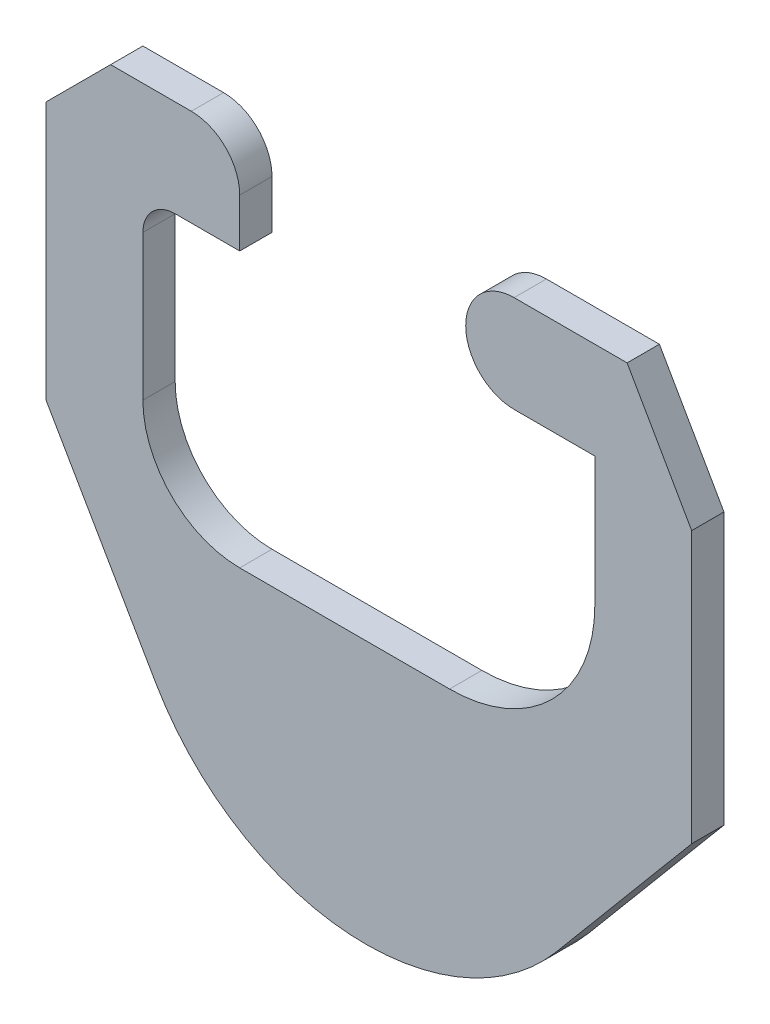
ISO-10303-21;
HEADER;
FILE_DESCRIPTION(('STEP AP214'),'2;1');
FILE_NAME('part.step','',(''),(''),'','','');
FILE_SCHEMA(('AUTOMOTIVE_DESIGN { 1 0 10303 214 1 1 1 1 }'));
ENDSEC;
DATA;
#1=APPLICATION_CONTEXT('core data for automotive mechanical design processes');
#2=APPLICATION_PROTOCOL_DEFINITION('international standard','automotive_design',2000,#1);
#3=PRODUCT_CONTEXT('',#1,'mechanical');
#4=PRODUCT('Part','Part','',(#3));
#5=PRODUCT_RELATED_PRODUCT_CATEGORY('part','',(#4));
#6=PRODUCT_DEFINITION_FORMATION('','',#4);
#7=PRODUCT_DEFINITION_CONTEXT('part definition',#1,'design');
#8=PRODUCT_DEFINITION('design','',#6,#7);
#9=PRODUCT_DEFINITION_SHAPE('','',#8);
#10=(LENGTH_UNIT() NAMED_UNIT(*) SI_UNIT(.MILLI.,.METRE.));
#11=(NAMED_UNIT(*) PLANE_ANGLE_UNIT() SI_UNIT($,.RADIAN.));
#12=(NAMED_UNIT(*) SI_UNIT($,.STERADIAN.) SOLID_ANGLE_UNIT());
#13=UNCERTAINTY_MEASURE_WITH_UNIT(LENGTH_MEASURE(1.E-05),#10,'distance_accuracy_value','');
#14=(GEOMETRIC_REPRESENTATION_CONTEXT(3) GLOBAL_UNCERTAINTY_ASSIGNED_CONTEXT((#13)) GLOBAL_UNIT_ASSIGNED_CONTEXT((#10,
#11,#12)) REPRESENTATION_CONTEXT('',''));
#15=CARTESIAN_POINT('',(0.,0.,0.));
#16=DIRECTION('',(0.,0.,1.));
#17=DIRECTION('',(1.,0.,0.));
#18=AXIS2_PLACEMENT_3D('',#15,#16,#17);
#19=CARTESIAN_POINT('',(0.,-15.,10.));
#20=DIRECTION('',(0.,0.,-1.));
#21=DIRECTION('',(-1.,0.,0.));
#22=AXIS2_PLACEMENT_3D('',#19,#20,#21);
#23=CYLINDRICAL_SURFACE('',#22,15.);
#24=CARTESIAN_POINT('',(0.,-15.,0.));
#25=DIRECTION('',(0.,0.,1.));
#26=DIRECTION('',(-1.,0.,0.));
#27=AXIS2_PLACEMENT_3D('',#24,#25,#26);
#28=CIRCLE('',#27,15.);
#29=CARTESIAN_POINT('',(0.,0.,0.));
#30=VERTEX_POINT('',#29);
#31=CARTESIAN_POINT('',(0.,-30.,0.));
#32=VERTEX_POINT('',#31);
#33=EDGE_CURVE('E218',#30,#32,#28,.T.);
#34=ORIENTED_EDGE('',*,*,#33,.T.);
#35=DIRECTION('',(0.,0.,-1.));
#36=VECTOR('',#35,1.);
#37=CARTESIAN_POINT('',(0.,-30.,10.));
#38=LINE('',#37,#36);
#39=CARTESIAN_POINT('',(0.,-30.,10.));
#40=VERTEX_POINT('',#39);
#41=EDGE_CURVE('E11',#40,#32,#38,.T.);
#42=ORIENTED_EDGE('',*,*,#41,.F.);
#43=CARTESIAN_POINT('',(0.,-15.,10.));
#44=DIRECTION('',(0.,0.,1.));
#45=DIRECTION('',(-1.,0.,0.));
#46=AXIS2_PLACEMENT_3D('',#43,#44,#45);
#47=CIRCLE('',#46,15.);
#48=CARTESIAN_POINT('',(0.,0.,10.));
#49=VERTEX_POINT('',#48);
#50=EDGE_CURVE('E279',#49,#40,#47,.T.);
#51=ORIENTED_EDGE('',*,*,#50,.F.);
#52=DIRECTION('',(0.,0.,-1.));
#53=VECTOR('',#52,1.);
#54=CARTESIAN_POINT('',(0.,0.,10.));
#55=LINE('',#54,#53);
#56=EDGE_CURVE('E214',#49,#30,#55,.T.);
#57=ORIENTED_EDGE('',*,*,#56,.T.);
#58=EDGE_LOOP('',(#34,#42,#51,#57));
#59=FACE_BOUND('',#58,.T.);
#60=ADVANCED_FACE('F39',(#59),#23,.T.);
#61=CARTESIAN_POINT('',(25.,-30.,10.));
#62=DIRECTION('',(0.,1.,0.));
#63=DIRECTION('',(0.,0.,1.));
#64=AXIS2_PLACEMENT_3D('',#61,#62,#63);
#65=PLANE('',#64);
#66=DIRECTION('',(1.,0.,0.));
#67=VECTOR('',#66,1.);
#68=CARTESIAN_POINT('',(25.,-30.,0.));
#69=LINE('',#68,#67);
#70=CARTESIAN_POINT('',(25.,-30.,0.));
#71=VERTEX_POINT('',#70);
#72=EDGE_CURVE('E222',#32,#71,#69,.T.);
#73=ORIENTED_EDGE('',*,*,#72,.T.);
#74=DIRECTION('',(0.,0.,-1.));
#75=VECTOR('',#74,1.);
#76=CARTESIAN_POINT('',(25.,-30.,10.));
#77=LINE('',#76,#75);
#78=CARTESIAN_POINT('',(25.,-30.,10.));
#79=VERTEX_POINT('',#78);
#80=EDGE_CURVE('E48',#79,#71,#77,.T.);
#81=ORIENTED_EDGE('',*,*,#80,.F.);
#82=DIRECTION('',(1.,0.,0.));
#83=VECTOR('',#82,1.);
#84=CARTESIAN_POINT('',(25.,-30.,10.));
#85=LINE('',#84,#83);
#86=EDGE_CURVE('E138',#40,#79,#85,.T.);
#87=ORIENTED_EDGE('',*,*,#86,.F.);
#88=ORIENTED_EDGE('',*,*,#41,.T.);
#89=EDGE_LOOP('',(#73,#81,#87,#88));
#90=FACE_BOUND('',#89,.T.);
#91=ADVANCED_FACE('F436',(#90),#65,.F.);
#92=CARTESIAN_POINT('',(25.,-70.,10.));
#93=DIRECTION('',(1.,0.,0.));
#94=DIRECTION('',(0.,1.,0.));
#95=AXIS2_PLACEMENT_3D('',#92,#93,#94);
#96=PLANE('',#95);
#97=DIRECTION('',(0.,-1.,0.));
#98=VECTOR('',#97,1.);
#99=CARTESIAN_POINT('',(25.,-70.,0.));
#100=LINE('',#99,#98);
#101=CARTESIAN_POINT('',(25.,-70.,0.));
#102=VERTEX_POINT('',#101);
#103=EDGE_CURVE('E225',#71,#102,#100,.T.);
#104=ORIENTED_EDGE('',*,*,#103,.T.);
#105=DIRECTION('',(0.,0.,-1.));
#106=VECTOR('',#105,1.);
#107=CARTESIAN_POINT('',(25.,-70.,10.));
#108=LINE('',#107,#106);
#109=CARTESIAN_POINT('',(25.,-70.,10.));
#110=VERTEX_POINT('',#109);
#111=EDGE_CURVE('E342',#110,#102,#108,.T.);
#112=ORIENTED_EDGE('',*,*,#111,.F.);
#113=DIRECTION('',(0.,-1.,0.));
#114=VECTOR('',#113,1.);
#115=CARTESIAN_POINT('',(25.,-70.,10.));
#116=LINE('',#115,#114);
#117=EDGE_CURVE('E352',#79,#110,#116,.T.);
#118=ORIENTED_EDGE('',*,*,#117,.F.);
#119=ORIENTED_EDGE('',*,*,#80,.T.);
#120=EDGE_LOOP('',(#104,#112,#118,#119));
#121=FACE_BOUND('',#120,.T.);
#122=ADVANCED_FACE('F350',(#121),#96,.F.);
#123=CARTESIAN_POINT('',(-20.,-70.,10.));
#124=DIRECTION('',(0.,0.,-1.));
#125=DIRECTION('',(-1.,0.,0.));
#126=AXIS2_PLACEMENT_3D('',#123,#124,#125);
#127=CYLINDRICAL_SURFACE('',#126,45.);
#128=CARTESIAN_POINT('',(-20.,-70.,0.));
#129=DIRECTION('',(0.,0.,-1.));
#130=DIRECTION('',(1.,0.,0.));
#131=AXIS2_PLACEMENT_3D('',#128,#129,#130);
#132=CIRCLE('',#131,45.);
#133=CARTESIAN_POINT('',(-20.,-115.,0.));
#134=VERTEX_POINT('',#133);
#135=EDGE_CURVE('E228',#102,#134,#132,.T.);
#136=ORIENTED_EDGE('',*,*,#135,.T.);
#137=DIRECTION('',(0.,0.,-1.));
#138=VECTOR('',#137,1.);
#139=CARTESIAN_POINT('',(-20.,-115.,10.));
#140=LINE('',#139,#138);
#141=CARTESIAN_POINT('',(-20.,-115.,10.));
#142=VERTEX_POINT('',#141);
#143=EDGE_CURVE('E338',#142,#134,#140,.T.);
#144=ORIENTED_EDGE('',*,*,#143,.F.);
#145=CARTESIAN_POINT('',(-20.,-70.,10.));
#146=DIRECTION('',(0.,0.,-1.));
#147=DIRECTION('',(1.,0.,0.));
#148=AXIS2_PLACEMENT_3D('',#145,#146,#147);
#149=CIRCLE('',#148,45.);
#150=EDGE_CURVE('E371',#110,#142,#149,.T.);
#151=ORIENTED_EDGE('',*,*,#150,.F.);
#152=ORIENTED_EDGE('',*,*,#111,.T.);
#153=EDGE_LOOP('',(#136,#144,#151,#152));
#154=FACE_BOUND('',#153,.T.);
#155=ADVANCED_FACE('F361',(#154),#127,.F.);
#156=CARTESIAN_POINT('',(-85.,-115.,10.));
#157=DIRECTION('',(0.,-1.,0.));
#158=DIRECTION('',(1.,0.,0.));
#159=AXIS2_PLACEMENT_3D('',#156,#157,#158);
#160=PLANE('',#159);
#161=DIRECTION('',(-1.,0.,0.));
#162=VECTOR('',#161,1.);
#163=CARTESIAN_POINT('',(-85.,-115.,0.));
#164=LINE('',#163,#162);
#165=CARTESIAN_POINT('',(-85.,-115.,0.));
#166=VERTEX_POINT('',#165);
#167=EDGE_CURVE('E231',#134,#166,#164,.T.);
#168=ORIENTED_EDGE('',*,*,#167,.T.);
#169=DIRECTION('',(0.,0.,-1.));
#170=VECTOR('',#169,1.);
#171=CARTESIAN_POINT('',(-85.,-115.,10.));
#172=LINE('',#171,#170);
#173=CARTESIAN_POINT('',(-85.,-115.,10.));
#174=VERTEX_POINT('',#173);
#175=EDGE_CURVE('E334',#174,#166,#172,.T.);
#176=ORIENTED_EDGE('',*,*,#175,.F.);
#177=DIRECTION('',(-1.,0.,0.));
#178=VECTOR('',#177,1.);
#179=CARTESIAN_POINT('',(-85.,-115.,10.));
#180=LINE('',#179,#178);
#181=EDGE_CURVE('E367',#142,#174,#180,.T.);
#182=ORIENTED_EDGE('',*,*,#181,.F.);
#183=ORIENTED_EDGE('',*,*,#143,.T.);
#184=EDGE_LOOP('',(#168,#176,#182,#183));
#185=FACE_BOUND('',#184,.T.);
#186=ADVANCED_FACE('F365',(#185),#160,.F.);
#187=CARTESIAN_POINT('',(-85.,-84.9999999999999,10.));
#188=DIRECTION('',(0.,0.,-1.));
#189=DIRECTION('',(-1.,0.,0.));
#190=AXIS2_PLACEMENT_3D('',#187,#188,#189);
#191=CYLINDRICAL_SURFACE('',#190,30.);
#192=CARTESIAN_POINT('',(-85.,-84.9999999999999,0.));
#193=DIRECTION('',(0.,0.,-1.));
#194=DIRECTION('',(1.,0.,0.));
#195=AXIS2_PLACEMENT_3D('',#192,#193,#194);
#196=CIRCLE('',#195,30.);
#197=CARTESIAN_POINT('',(-115.,-84.9999999999999,0.));
#198=VERTEX_POINT('',#197);
#199=EDGE_CURVE('E234',#166,#198,#196,.T.);
#200=ORIENTED_EDGE('',*,*,#199,.T.);
#201=DIRECTION('',(0.,0.,-1.));
#202=VECTOR('',#201,1.);
#203=CARTESIAN_POINT('',(-115.,-84.9999999999999,10.));
#204=LINE('',#203,#202);
#205=CARTESIAN_POINT('',(-115.,-84.9999999999999,10.));
#206=VERTEX_POINT('',#205);
#207=EDGE_CURVE('E330',#206,#198,#204,.T.);
#208=ORIENTED_EDGE('',*,*,#207,.F.);
#209=CARTESIAN_POINT('',(-85.,-84.9999999999999,10.));
#210=DIRECTION('',(0.,0.,-1.));
#211=DIRECTION('',(1.,0.,0.));
#212=AXIS2_PLACEMENT_3D('',#209,#210,#211);
#213=CIRCLE('',#212,30.);
#214=EDGE_CURVE('E370',#174,#206,#213,.T.);
#215=ORIENTED_EDGE('',*,*,#214,.F.);
#216=ORIENTED_EDGE('',*,*,#175,.T.);
#217=EDGE_LOOP('',(#200,#208,#215,#216));
#218=FACE_BOUND('',#217,.T.);
#219=ADVANCED_FACE('F449',(#218),#191,.F.);
#220=CARTESIAN_POINT('',(-115.,-40.,10.));
#221=DIRECTION('',(-1.,0.,0.));
#222=DIRECTION('',(0.,0.,1.));
#223=AXIS2_PLACEMENT_3D('',#220,#221,#222);
#224=PLANE('',#223);
#225=DIRECTION('',(0.,1.,0.));
#226=VECTOR('',#225,1.);
#227=CARTESIAN_POINT('',(-115.,-40.,0.));
#228=LINE('',#227,#226);
#229=CARTESIAN_POINT('',(-115.,-40.,0.));
#230=VERTEX_POINT('',#229);
#231=EDGE_CURVE('E237',#198,#230,#228,.T.);
#232=ORIENTED_EDGE('',*,*,#231,.T.);
#233=DIRECTION('',(0.,0.,-1.));
#234=VECTOR('',#233,1.);
#235=CARTESIAN_POINT('',(-115.,-40.,10.));
#236=LINE('',#235,#234);
#237=CARTESIAN_POINT('',(-115.,-40.,10.));
#238=VERTEX_POINT('',#237);
#239=EDGE_CURVE('E326',#238,#230,#236,.T.);
#240=ORIENTED_EDGE('',*,*,#239,.F.);
#241=DIRECTION('',(0.,1.,0.));
#242=VECTOR('',#241,1.);
#243=CARTESIAN_POINT('',(-115.,-40.,10.));
#244=LINE('',#243,#242);
#245=EDGE_CURVE('E375',#206,#238,#244,.T.);
#246=ORIENTED_EDGE('',*,*,#245,.F.);
#247=ORIENTED_EDGE('',*,*,#207,.T.);
#248=EDGE_LOOP('',(#232,#240,#246,#247));
#249=FACE_BOUND('',#248,.T.);
#250=ADVANCED_FACE('F452',(#249),#224,.F.);
#251=CARTESIAN_POINT('',(-105.,-40.,10.));
#252=DIRECTION('',(0.,0.,-1.));
#253=DIRECTION('',(-1.,0.,0.));
#254=AXIS2_PLACEMENT_3D('',#251,#252,#253);
#255=CYLINDRICAL_SURFACE('',#254,10.);
#256=CARTESIAN_POINT('',(-105.,-40.,0.));
#257=DIRECTION('',(0.,0.,-1.));
#258=DIRECTION('',(1.,0.,0.));
#259=AXIS2_PLACEMENT_3D('',#256,#257,#258);
#260=CIRCLE('',#259,10.);
#261=CARTESIAN_POINT('',(-105.,-30.,0.));
#262=VERTEX_POINT('',#261);
#263=EDGE_CURVE('E240',#230,#262,#260,.T.);
#264=ORIENTED_EDGE('',*,*,#263,.T.);
#265=DIRECTION('',(0.,0.,-1.));
#266=VECTOR('',#265,1.);
#267=CARTESIAN_POINT('',(-105.,-30.,10.));
#268=LINE('',#267,#266);
#269=CARTESIAN_POINT('',(-105.,-30.,10.));
#270=VERTEX_POINT('',#269);
#271=EDGE_CURVE('E322',#270,#262,#268,.T.);
#272=ORIENTED_EDGE('',*,*,#271,.F.);
#273=CARTESIAN_POINT('',(-105.,-40.,10.));
#274=DIRECTION('',(0.,0.,-1.));
#275=DIRECTION('',(1.,0.,0.));
#276=AXIS2_PLACEMENT_3D('',#273,#274,#275);
#277=CIRCLE('',#276,10.);
#278=EDGE_CURVE('E382',#238,#270,#277,.T.);
#279=ORIENTED_EDGE('',*,*,#278,.F.);
#280=ORIENTED_EDGE('',*,*,#239,.T.);
#281=EDGE_LOOP('',(#264,#272,#279,#280));
#282=FACE_BOUND('',#281,.T.);
#283=ADVANCED_FACE('F456',(#282),#255,.F.);
#284=CARTESIAN_POINT('',(-85.,-30.,10.));
#285=DIRECTION('',(0.,1.,0.));
#286=DIRECTION('',(0.,0.,1.));
#287=AXIS2_PLACEMENT_3D('',#284,#285,#286);
#288=PLANE('',#287);
#289=DIRECTION('',(1.,0.,0.));
#290=VECTOR('',#289,1.);
#291=CARTESIAN_POINT('',(-85.,-30.,0.));
#292=LINE('',#291,#290);
#293=CARTESIAN_POINT('',(-85.,-30.,0.));
#294=VERTEX_POINT('',#293);
#295=EDGE_CURVE('E243',#262,#294,#292,.T.);
#296=ORIENTED_EDGE('',*,*,#295,.T.);
#297=DIRECTION('',(0.,0.,-1.));
#298=VECTOR('',#297,1.);
#299=CARTESIAN_POINT('',(-85.,-30.,10.));
#300=LINE('',#299,#298);
#301=CARTESIAN_POINT('',(-85.,-30.,10.));
#302=VERTEX_POINT('',#301);
#303=EDGE_CURVE('E318',#302,#294,#300,.T.);
#304=ORIENTED_EDGE('',*,*,#303,.F.);
#305=DIRECTION('',(1.,0.,0.));
#306=VECTOR('',#305,1.);
#307=CARTESIAN_POINT('',(-85.,-30.,10.));
#308=LINE('',#307,#306);
#309=EDGE_CURVE('E385',#270,#302,#308,.T.);
#310=ORIENTED_EDGE('',*,*,#309,.F.);
#311=ORIENTED_EDGE('',*,*,#271,.T.);
#312=EDGE_LOOP('',(#296,#304,#310,#311));
#313=FACE_BOUND('',#312,.T.);
#314=ADVANCED_FACE('F460',(#313),#288,.F.);
#315=CARTESIAN_POINT('',(-85.,-15.,10.));
#316=DIRECTION('',(-1.,0.,0.));
#317=DIRECTION('',(0.,0.,1.));
#318=AXIS2_PLACEMENT_3D('',#315,#316,#317);
#319=PLANE('',#318);
#320=DIRECTION('',(0.,1.,0.));
#321=VECTOR('',#320,1.);
#322=CARTESIAN_POINT('',(-85.,-15.,0.));
#323=LINE('',#322,#321);
#324=CARTESIAN_POINT('',(-85.,-15.,0.));
#325=VERTEX_POINT('',#324);
#326=EDGE_CURVE('E246',#294,#325,#323,.T.);
#327=ORIENTED_EDGE('',*,*,#326,.T.);
#328=DIRECTION('',(0.,0.,-1.));
#329=VECTOR('',#328,1.);
#330=CARTESIAN_POINT('',(-85.,-15.,10.));
#331=LINE('',#330,#329);
#332=CARTESIAN_POINT('',(-85.,-15.,10.));
#333=VERTEX_POINT('',#332);
#334=EDGE_CURVE('E314',#333,#325,#331,.T.);
#335=ORIENTED_EDGE('',*,*,#334,.F.);
#336=DIRECTION('',(0.,1.,0.));
#337=VECTOR('',#336,1.);
#338=CARTESIAN_POINT('',(-85.,-15.,10.));
#339=LINE('',#338,#337);
#340=EDGE_CURVE('E388',#302,#333,#339,.T.);
#341=ORIENTED_EDGE('',*,*,#340,.F.);
#342=ORIENTED_EDGE('',*,*,#303,.T.);
#343=EDGE_LOOP('',(#327,#335,#341,#342));
#344=FACE_BOUND('',#343,.T.);
#345=ADVANCED_FACE('F464',(#344),#319,.F.);
#346=CARTESIAN_POINT('',(-100.,-15.,10.));
#347=DIRECTION('',(0.,0.,-1.));
#348=DIRECTION('',(-1.,0.,0.));
#349=AXIS2_PLACEMENT_3D('',#346,#347,#348);
#350=CYLINDRICAL_SURFACE('',#349,15.);
#351=CARTESIAN_POINT('',(-100.,-15.,0.));
#352=DIRECTION('',(0.,0.,1.));
#353=DIRECTION('',(-1.,0.,0.));
#354=AXIS2_PLACEMENT_3D('',#351,#352,#353);
#355=CIRCLE('',#354,15.);
#356=CARTESIAN_POINT('',(-100.,0.,0.));
#357=VERTEX_POINT('',#356);
#358=EDGE_CURVE('E249',#325,#357,#355,.T.);
#359=ORIENTED_EDGE('',*,*,#358,.T.);
#360=DIRECTION('',(0.,0.,-1.));
#361=VECTOR('',#360,1.);
#362=CARTESIAN_POINT('',(-100.,0.,10.));
#363=LINE('',#362,#361);
#364=CARTESIAN_POINT('',(-100.,0.,10.));
#365=VERTEX_POINT('',#364);
#366=EDGE_CURVE('E310',#365,#357,#363,.T.);
#367=ORIENTED_EDGE('',*,*,#366,.F.);
#368=CARTESIAN_POINT('',(-100.,-15.,10.));
#369=DIRECTION('',(0.,0.,1.));
#370=DIRECTION('',(-1.,0.,0.));
#371=AXIS2_PLACEMENT_3D('',#368,#369,#370);
#372=CIRCLE('',#371,15.);
#373=EDGE_CURVE('E391',#333,#365,#372,.T.);
#374=ORIENTED_EDGE('',*,*,#373,.F.);
#375=ORIENTED_EDGE('',*,*,#334,.T.);
#376=EDGE_LOOP('',(#359,#367,#374,#375));
#377=FACE_BOUND('',#376,.T.);
#378=ADVANCED_FACE('F468',(#377),#350,.T.);
#379=CARTESIAN_POINT('',(-125.,0.,10.));
#380=DIRECTION('',(0.,-1.,0.));
#381=DIRECTION('',(0.,0.,-1.));
#382=AXIS2_PLACEMENT_3D('',#379,#380,#381);
#383=PLANE('',#382);
#384=DIRECTION('',(-1.,0.,0.));
#385=VECTOR('',#384,1.);
#386=CARTESIAN_POINT('',(-125.,0.,0.));
#387=LINE('',#386,#385);
#388=CARTESIAN_POINT('',(-125.,0.,0.));
#389=VERTEX_POINT('',#388);
#390=EDGE_CURVE('E252',#357,#389,#387,.T.);
#391=ORIENTED_EDGE('',*,*,#390,.T.);
#392=DIRECTION('',(0.,0.,-1.));
#393=VECTOR('',#392,1.);
#394=CARTESIAN_POINT('',(-125.,0.,10.));
#395=LINE('',#394,#393);
#396=CARTESIAN_POINT('',(-125.,0.,10.));
#397=VERTEX_POINT('',#396);
#398=EDGE_CURVE('E306',#397,#389,#395,.T.);
#399=ORIENTED_EDGE('',*,*,#398,.F.);
#400=DIRECTION('',(-1.,0.,0.));
#401=VECTOR('',#400,1.);
#402=CARTESIAN_POINT('',(-125.,0.,10.));
#403=LINE('',#402,#401);
#404=EDGE_CURVE('E394',#365,#397,#403,.T.);
#405=ORIENTED_EDGE('',*,*,#404,.F.);
#406=ORIENTED_EDGE('',*,*,#366,.T.);
#407=EDGE_LOOP('',(#391,#399,#405,#406));
#408=FACE_BOUND('',#407,.T.);
#409=ADVANCED_FACE('F472',(#408),#383,.F.);
#410=CARTESIAN_POINT('',(-145.,-19.9999999999999,10.));
#411=DIRECTION('',(0.707106781186546,-0.707106781186549,0.));
#412=DIRECTION('',(0.707106781186549,0.707106781186546,0.));
#413=AXIS2_PLACEMENT_3D('',#410,#411,#412);
#414=PLANE('',#413);
#415=DIRECTION('',(-0.707106781186549,-0.707106781186546,0.));
#416=VECTOR('',#415,1.);
#417=CARTESIAN_POINT('',(-145.,-19.9999999999999,0.));
#418=LINE('',#417,#416);
#419=CARTESIAN_POINT('',(-145.,-19.9999999999999,0.));
#420=VERTEX_POINT('',#419);
#421=EDGE_CURVE('E255',#389,#420,#418,.T.);
#422=ORIENTED_EDGE('',*,*,#421,.T.);
#423=DIRECTION('',(0.,0.,-1.));
#424=VECTOR('',#423,1.);
#425=CARTESIAN_POINT('',(-145.,-19.9999999999999,10.));
#426=LINE('',#425,#424);
#427=CARTESIAN_POINT('',(-145.,-19.9999999999999,10.));
#428=VERTEX_POINT('',#427);
#429=EDGE_CURVE('E302',#428,#420,#426,.T.);
#430=ORIENTED_EDGE('',*,*,#429,.F.);
#431=DIRECTION('',(-0.707106781186549,-0.707106781186546,0.));
#432=VECTOR('',#431,1.);
#433=CARTESIAN_POINT('',(-145.,-19.9999999999999,10.));
#434=LINE('',#433,#432);
#435=EDGE_CURVE('E397',#397,#428,#434,.T.);
#436=ORIENTED_EDGE('',*,*,#435,.F.);
#437=ORIENTED_EDGE('',*,*,#398,.T.);
#438=EDGE_LOOP('',(#422,#430,#436,#437));
#439=FACE_BOUND('',#438,.T.);
#440=ADVANCED_FACE('F476',(#439),#414,.F.);
#441=CARTESIAN_POINT('',(-145.,-99.9999999999999,10.));
#442=DIRECTION('',(1.,0.,0.));
#443=DIRECTION('',(0.,0.,-1.));
#444=AXIS2_PLACEMENT_3D('',#441,#442,#443);
#445=PLANE('',#444);
#446=DIRECTION('',(0.,-1.,0.));
#447=VECTOR('',#446,1.);
#448=CARTESIAN_POINT('',(-145.,-99.9999999999999,0.));
#449=LINE('',#448,#447);
#450=CARTESIAN_POINT('',(-145.,-99.9999999999999,0.));
#451=VERTEX_POINT('',#450);
#452=EDGE_CURVE('E258',#420,#451,#449,.T.);
#453=ORIENTED_EDGE('',*,*,#452,.T.);
#454=DIRECTION('',(0.,0.,-1.));
#455=VECTOR('',#454,1.);
#456=CARTESIAN_POINT('',(-145.,-99.9999999999999,10.));
#457=LINE('',#456,#455);
#458=CARTESIAN_POINT('',(-145.,-99.9999999999999,10.));
#459=VERTEX_POINT('',#458);
#460=EDGE_CURVE('E298',#459,#451,#457,.T.);
#461=ORIENTED_EDGE('',*,*,#460,.F.);
#462=DIRECTION('',(0.,-1.,0.));
#463=VECTOR('',#462,1.);
#464=CARTESIAN_POINT('',(-145.,-99.9999999999999,10.));
#465=LINE('',#464,#463);
#466=EDGE_CURVE('E400',#428,#459,#465,.T.);
#467=ORIENTED_EDGE('',*,*,#466,.F.);
#468=ORIENTED_EDGE('',*,*,#429,.T.);
#469=EDGE_LOOP('',(#453,#461,#467,#468));
#470=FACE_BOUND('',#469,.T.);
#471=ADVANCED_FACE('F480',(#470),#445,.F.);
#472=CARTESIAN_POINT('',(-145.,-99.9999999999999,10.));
#473=DIRECTION('',(0.866025403784442,0.499999999999994,0.));
#474=DIRECTION('',(-0.499999999999995,0.866025403784442,0.));
#475=AXIS2_PLACEMENT_3D('',#472,#473,#474);
#476=PLANE('',#475);
#477=DIRECTION('',(0.499999999999995,-0.866025403784442,0.));
#478=VECTOR('',#477,1.);
#479=CARTESIAN_POINT('',(-145.,-99.9999999999999,0.));
#480=LINE('',#479,#478);
#481=CARTESIAN_POINT('',(-110.975129822193,-158.932803868898,0.));
#482=VERTEX_POINT('',#481);
#483=EDGE_CURVE('E261',#451,#482,#480,.T.);
#484=ORIENTED_EDGE('',*,*,#483,.T.);
#485=DIRECTION('',(0.,0.,-1.));
#486=VECTOR('',#485,1.);
#487=CARTESIAN_POINT('',(-110.975129822193,-158.932803868898,10.));
#488=LINE('',#487,#486);
#489=CARTESIAN_POINT('',(-110.975129822193,-158.932803868898,10.));
#490=VERTEX_POINT('',#489);
#491=EDGE_CURVE('E294',#490,#482,#488,.T.);
#492=ORIENTED_EDGE('',*,*,#491,.F.);
#493=DIRECTION('',(0.499999999999995,-0.866025403784442,0.));
#494=VECTOR('',#493,1.);
#495=CARTESIAN_POINT('',(-145.,-99.9999999999999,10.));
#496=LINE('',#495,#494);
#497=EDGE_CURVE('E403',#459,#490,#496,.T.);
#498=ORIENTED_EDGE('',*,*,#497,.F.);
#499=ORIENTED_EDGE('',*,*,#460,.T.);
#500=EDGE_LOOP('',(#484,#492,#498,#499));
#501=FACE_BOUND('',#500,.T.);
#502=ADVANCED_FACE('F484',(#501),#476,.F.);
#503=CARTESIAN_POINT('',(-46.0232245383597,-121.432803868898,10.));
#504=DIRECTION('',(0.,0.,-1.));
#505=DIRECTION('',(-1.,0.,0.));
#506=AXIS2_PLACEMENT_3D('',#503,#504,#505);
#507=CYLINDRICAL_SURFACE('',#506,75.);
#508=CARTESIAN_POINT('',(-46.0232245383597,-121.432803868898,0.));
#509=DIRECTION('',(0.,0.,1.));
#510=DIRECTION('',(1.,0.,0.));
#511=AXIS2_PLACEMENT_3D('',#508,#509,#510);
#512=CIRCLE('',#511,75.);
#513=CARTESIAN_POINT('',(-45.,-196.425823621033,0.));
#514=VERTEX_POINT('',#513);
#515=EDGE_CURVE('E264',#482,#514,#512,.T.);
#516=ORIENTED_EDGE('',*,*,#515,.T.);
#517=DIRECTION('',(0.,0.,-1.));
#518=VECTOR('',#517,1.);
#519=CARTESIAN_POINT('',(-45.,-196.425823621033,10.));
#520=LINE('',#519,#518);
#521=CARTESIAN_POINT('',(-45.,-196.425823621033,10.));
#522=VERTEX_POINT('',#521);
#523=EDGE_CURVE('E290',#522,#514,#520,.T.);
#524=ORIENTED_EDGE('',*,*,#523,.F.);
#525=CARTESIAN_POINT('',(-46.0232245383597,-121.432803868898,10.));
#526=DIRECTION('',(0.,0.,1.));
#527=DIRECTION('',(1.,0.,0.));
#528=AXIS2_PLACEMENT_3D('',#525,#526,#527);
#529=CIRCLE('',#528,75.);
#530=EDGE_CURVE('E406',#490,#522,#529,.T.);
#531=ORIENTED_EDGE('',*,*,#530,.F.);
#532=ORIENTED_EDGE('',*,*,#491,.T.);
#533=EDGE_LOOP('',(#516,#524,#531,#532));
#534=FACE_BOUND('',#533,.T.);
#535=ADVANCED_FACE('F488',(#534),#507,.T.);
#536=CARTESIAN_POINT('',(-46.0556582580823,-119.055708233865,10.));
#537=DIRECTION('',(0.,0.,-1.));
#538=DIRECTION('',(-1.,0.,0.));
#539=AXIS2_PLACEMENT_3D('',#536,#537,#538);
#540=CYLINDRICAL_SURFACE('',#539,77.3773168918491);
#541=CARTESIAN_POINT('',(-46.0556582580823,-119.055708233865,0.));
#542=DIRECTION('',(0.,0.,1.));
#543=DIRECTION('',(1.,0.,0.));
#544=AXIS2_PLACEMENT_3D('',#541,#542,#543);
#545=CIRCLE('',#544,77.3773168918491);
#546=CARTESIAN_POINT('',(13.2188053703752,-168.792888802734,0.));
#547=VERTEX_POINT('',#546);
#548=EDGE_CURVE('E267',#514,#547,#545,.T.);
#549=ORIENTED_EDGE('',*,*,#548,.T.);
#550=DIRECTION('',(0.,0.,-1.));
#551=VECTOR('',#550,1.);
#552=CARTESIAN_POINT('',(13.2188053703752,-168.792888802734,10.));
#553=LINE('',#552,#551);
#554=CARTESIAN_POINT('',(13.2188053703752,-168.792888802734,10.));
#555=VERTEX_POINT('',#554);
#556=EDGE_CURVE('E286',#555,#547,#553,.T.);
#557=ORIENTED_EDGE('',*,*,#556,.F.);
#558=CARTESIAN_POINT('',(-46.0556582580823,-119.055708233865,10.));
#559=DIRECTION('',(0.,0.,1.));
#560=DIRECTION('',(1.,0.,0.));
#561=AXIS2_PLACEMENT_3D('',#558,#559,#560);
#562=CIRCLE('',#561,77.3773168918491);
#563=EDGE_CURVE('E409',#522,#555,#562,.T.);
#564=ORIENTED_EDGE('',*,*,#563,.F.);
#565=ORIENTED_EDGE('',*,*,#523,.T.);
#566=EDGE_LOOP('',(#549,#557,#564,#565));
#567=FACE_BOUND('',#566,.T.);
#568=ADVANCED_FACE('F417',(#567),#540,.T.);
#569=CARTESIAN_POINT('',(13.2188053703752,-168.792888802734,10.));
#570=DIRECTION('',(-0.766044443118982,0.642787609686535,0.));
#571=DIRECTION('',(-0.642787609686535,-0.766044443118982,0.));
#572=AXIS2_PLACEMENT_3D('',#569,#570,#571);
#573=PLANE('',#572);
#574=DIRECTION('',(0.642787609686535,0.766044443118982,0.));
#575=VECTOR('',#574,1.);
#576=CARTESIAN_POINT('',(13.2188053703752,-168.792888802734,0.));
#577=LINE('',#576,#575);
#578=CARTESIAN_POINT('',(55.,-119.,0.));
#579=VERTEX_POINT('',#578);
#580=EDGE_CURVE('E270',#547,#579,#577,.T.);
#581=ORIENTED_EDGE('',*,*,#580,.T.);
#582=DIRECTION('',(0.,0.,-1.));
#583=VECTOR('',#582,1.);
#584=CARTESIAN_POINT('',(55.,-119.,10.));
#585=LINE('',#584,#583);
#586=CARTESIAN_POINT('',(55.,-119.,10.));
#587=VERTEX_POINT('',#586);
#588=EDGE_CURVE('E207',#587,#579,#585,.T.);
#589=ORIENTED_EDGE('',*,*,#588,.F.);
#590=DIRECTION('',(0.642787609686535,0.766044443118982,0.));
#591=VECTOR('',#590,1.);
#592=CARTESIAN_POINT('',(13.2188053703752,-168.792888802734,10.));
#593=LINE('',#592,#591);
#594=EDGE_CURVE('E196',#555,#587,#593,.T.);
#595=ORIENTED_EDGE('',*,*,#594,.F.);
#596=ORIENTED_EDGE('',*,*,#556,.T.);
#597=EDGE_LOOP('',(#581,#589,#595,#596));
#598=FACE_BOUND('',#597,.T.);
#599=ADVANCED_FACE('F421',(#598),#573,.F.);
#600=CARTESIAN_POINT('',(55.,-35.,10.));
#601=DIRECTION('',(-1.,0.,0.));
#602=DIRECTION('',(0.,-1.,0.));
#603=AXIS2_PLACEMENT_3D('',#600,#601,#602);
#604=PLANE('',#603);
#605=DIRECTION('',(0.,1.,0.));
#606=VECTOR('',#605,1.);
#607=CARTESIAN_POINT('',(55.,-35.,0.));
#608=LINE('',#607,#606);
#609=CARTESIAN_POINT('',(55.,-35.,0.));
#610=VERTEX_POINT('',#609);
#611=EDGE_CURVE('E205',#579,#610,#608,.T.);
#612=ORIENTED_EDGE('',*,*,#611,.T.);
#613=DIRECTION('',(0.,0.,-1.));
#614=VECTOR('',#613,1.);
#615=CARTESIAN_POINT('',(55.,-35.,10.));
#616=LINE('',#615,#614);
#617=CARTESIAN_POINT('',(55.,-35.,10.));
#618=VERTEX_POINT('',#617);
#619=EDGE_CURVE('E202',#618,#610,#616,.T.);
#620=ORIENTED_EDGE('',*,*,#619,.F.);
#621=DIRECTION('',(0.,1.,0.));
#622=VECTOR('',#621,1.);
#623=CARTESIAN_POINT('',(55.,-35.,10.));
#624=LINE('',#623,#622);
#625=EDGE_CURVE('E190',#587,#618,#624,.T.);
#626=ORIENTED_EDGE('',*,*,#625,.F.);
#627=ORIENTED_EDGE('',*,*,#588,.T.);
#628=EDGE_LOOP('',(#612,#620,#626,#627));
#629=FACE_BOUND('',#628,.T.);
#630=ADVANCED_FACE('F203',(#629),#604,.F.);
#631=CARTESIAN_POINT('',(35.,0.,10.));
#632=DIRECTION('',(-0.868243142124459,-0.496138938356834,0.));
#633=DIRECTION('',(0.496138938356834,-0.868243142124459,0.));
#634=AXIS2_PLACEMENT_3D('',#631,#632,#633);
#635=PLANE('',#634);
#636=DIRECTION('',(-0.496138938356834,0.868243142124459,0.));
#637=VECTOR('',#636,1.);
#638=CARTESIAN_POINT('',(35.,0.,0.));
#639=LINE('',#638,#637);
#640=CARTESIAN_POINT('',(35.,0.,0.));
#641=VERTEX_POINT('',#640);
#642=EDGE_CURVE('E124',#610,#641,#639,.T.);
#643=ORIENTED_EDGE('',*,*,#642,.T.);
#644=DIRECTION('',(0.,0.,-1.));
#645=VECTOR('',#644,1.);
#646=CARTESIAN_POINT('',(35.,0.,10.));
#647=LINE('',#646,#645);
#648=CARTESIAN_POINT('',(35.,0.,10.));
#649=VERTEX_POINT('',#648);
#650=EDGE_CURVE('E208',#649,#641,#647,.T.);
#651=ORIENTED_EDGE('',*,*,#650,.F.);
#652=DIRECTION('',(-0.496138938356834,0.868243142124459,0.));
#653=VECTOR('',#652,1.);
#654=CARTESIAN_POINT('',(35.,0.,10.));
#655=LINE('',#654,#653);
#656=EDGE_CURVE('E194',#618,#649,#655,.T.);
#657=ORIENTED_EDGE('',*,*,#656,.F.);
#658=ORIENTED_EDGE('',*,*,#619,.T.);
#659=EDGE_LOOP('',(#643,#651,#657,#658));
#660=FACE_BOUND('',#659,.T.);
#661=ADVANCED_FACE('F210',(#660),#635,.F.);
#662=CARTESIAN_POINT('',(0.,0.,10.));
#663=DIRECTION('',(0.,-1.,0.));
#664=DIRECTION('',(0.,0.,-1.));
#665=AXIS2_PLACEMENT_3D('',#662,#663,#664);
#666=PLANE('',#665);
#667=DIRECTION('',(-1.,0.,0.));
#668=VECTOR('',#667,1.);
#669=CARTESIAN_POINT('',(0.,0.,0.));
#670=LINE('',#669,#668);
#671=EDGE_CURVE('E130',#641,#30,#670,.T.);
#672=ORIENTED_EDGE('',*,*,#671,.T.);
#673=ORIENTED_EDGE('',*,*,#56,.F.);
#674=DIRECTION('',(-1.,0.,0.));
#675=VECTOR('',#674,1.);
#676=CARTESIAN_POINT('',(0.,0.,10.));
#677=LINE('',#676,#675);
#678=EDGE_CURVE('E56',#649,#49,#677,.T.);
#679=ORIENTED_EDGE('',*,*,#678,.F.);
#680=ORIENTED_EDGE('',*,*,#650,.T.);
#681=EDGE_LOOP('',(#672,#673,#679,#680));
#682=FACE_BOUND('',#681,.T.);
#683=ADVANCED_FACE('F425',(#682),#666,.F.);
#684=CARTESIAN_POINT('',(0.,-15.,10.));
#685=DIRECTION('',(0.,0.,-1.));
#686=DIRECTION('',(-1.,0.,0.));
#687=AXIS2_PLACEMENT_3D('',#684,#685,#686);
#688=PLANE('',#687);
#689=ORIENTED_EDGE('',*,*,#50,.T.);
#690=ORIENTED_EDGE('',*,*,#86,.T.);
#691=ORIENTED_EDGE('',*,*,#117,.T.);
#692=ORIENTED_EDGE('',*,*,#150,.T.);
#693=ORIENTED_EDGE('',*,*,#181,.T.);
#694=ORIENTED_EDGE('',*,*,#214,.T.);
#695=ORIENTED_EDGE('',*,*,#245,.T.);
#696=ORIENTED_EDGE('',*,*,#278,.T.);
#697=ORIENTED_EDGE('',*,*,#309,.T.);
#698=ORIENTED_EDGE('',*,*,#340,.T.);
#699=ORIENTED_EDGE('',*,*,#373,.T.);
#700=ORIENTED_EDGE('',*,*,#404,.T.);
#701=ORIENTED_EDGE('',*,*,#435,.T.);
#702=ORIENTED_EDGE('',*,*,#466,.T.);
#703=ORIENTED_EDGE('',*,*,#497,.T.);
#704=ORIENTED_EDGE('',*,*,#530,.T.);
#705=ORIENTED_EDGE('',*,*,#563,.T.);
#706=ORIENTED_EDGE('',*,*,#594,.T.);
#707=ORIENTED_EDGE('',*,*,#625,.T.);
#708=ORIENTED_EDGE('',*,*,#656,.T.);
#709=ORIENTED_EDGE('',*,*,#678,.T.);
#710=EDGE_LOOP('',(#689,#690,#691,#692,#693,#694,#695,#696,#697,#698,#699,#700,#701,#702,#703,
#704,#705,#706,#707,#708,#709));
#711=FACE_BOUND('',#710,.T.);
#712=ADVANCED_FACE('F192',(#711),#688,.F.);
#713=CARTESIAN_POINT('',(0.,-15.,0.));
#714=DIRECTION('',(0.,0.,-1.));
#715=DIRECTION('',(-1.,0.,0.));
#716=AXIS2_PLACEMENT_3D('',#713,#714,#715);
#717=PLANE('',#716);
#718=ORIENTED_EDGE('',*,*,#33,.F.);
#719=ORIENTED_EDGE('',*,*,#671,.F.);
#720=ORIENTED_EDGE('',*,*,#642,.F.);
#721=ORIENTED_EDGE('',*,*,#611,.F.);
#722=ORIENTED_EDGE('',*,*,#580,.F.);
#723=ORIENTED_EDGE('',*,*,#548,.F.);
#724=ORIENTED_EDGE('',*,*,#515,.F.);
#725=ORIENTED_EDGE('',*,*,#483,.F.);
#726=ORIENTED_EDGE('',*,*,#452,.F.);
#727=ORIENTED_EDGE('',*,*,#421,.F.);
#728=ORIENTED_EDGE('',*,*,#390,.F.);
#729=ORIENTED_EDGE('',*,*,#358,.F.);
#730=ORIENTED_EDGE('',*,*,#326,.F.);
#731=ORIENTED_EDGE('',*,*,#295,.F.);
#732=ORIENTED_EDGE('',*,*,#263,.F.);
#733=ORIENTED_EDGE('',*,*,#231,.F.);
#734=ORIENTED_EDGE('',*,*,#199,.F.);
#735=ORIENTED_EDGE('',*,*,#167,.F.);
#736=ORIENTED_EDGE('',*,*,#135,.F.);
#737=ORIENTED_EDGE('',*,*,#103,.F.);
#738=ORIENTED_EDGE('',*,*,#72,.F.);
#739=EDGE_LOOP('',(#718,#719,#720,#721,#722,#723,#724,#725,#726,#727,#728,#729,#730,#731,#732,
#733,#734,#735,#736,#737,#738));
#740=FACE_BOUND('',#739,.T.);
#741=ADVANCED_FACE('F356',(#740),#717,.T.);
#742=CLOSED_SHELL('',(#60,#91,#122,#155,#186,#219,#250,#283,#314,#345,#378,#409,#440,#471,#502,
#535,#568,#599,#630,#661,#683,#712,#741));
#743=MANIFOLD_SOLID_BREP('B2',#742);
#744=ADVANCED_BREP_SHAPE_REPRESENTATION('',(#18,#743),#14);
#745=SHAPE_DEFINITION_REPRESENTATION(#9,#744);
ENDSEC;
END-ISO-10303-21;
